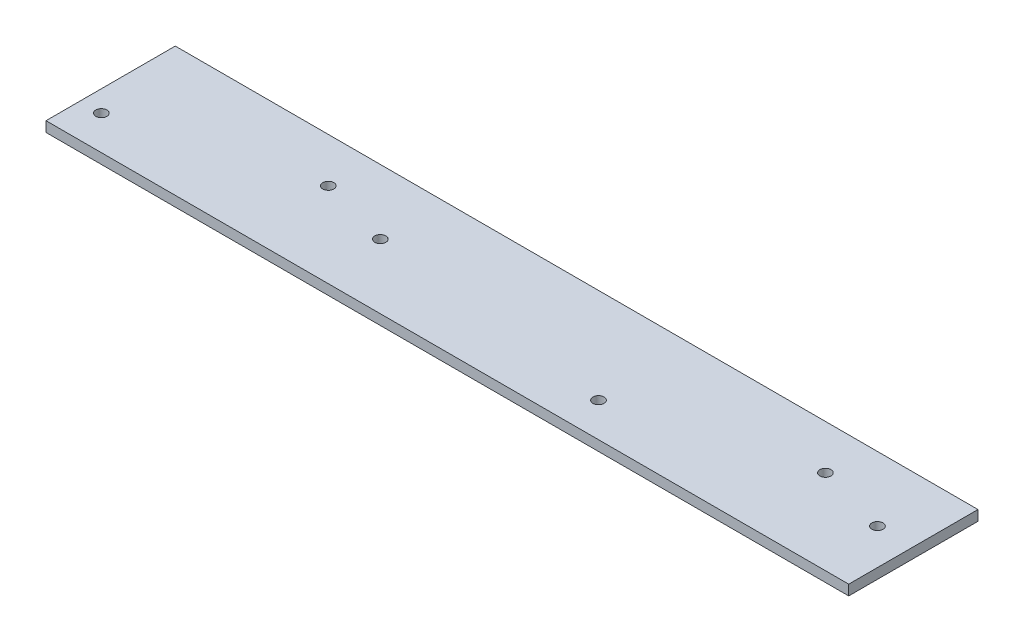
ISO-10303-21;
HEADER;
FILE_DESCRIPTION(('STEP AP214'),'2;1');
FILE_NAME('part.step','',(''),(''),'','','');
FILE_SCHEMA(('AUTOMOTIVE_DESIGN { 1 0 10303 214 1 1 1 1 }'));
ENDSEC;
DATA;
#1=APPLICATION_CONTEXT('core data for automotive mechanical design processes');
#2=APPLICATION_PROTOCOL_DEFINITION('international standard','automotive_design',2000,#1);
#3=PRODUCT_CONTEXT('',#1,'mechanical');
#4=PRODUCT('Part','Part','',(#3));
#5=PRODUCT_RELATED_PRODUCT_CATEGORY('part','',(#4));
#6=PRODUCT_DEFINITION_FORMATION('','',#4);
#7=PRODUCT_DEFINITION_CONTEXT('part definition',#1,'design');
#8=PRODUCT_DEFINITION('design','',#6,#7);
#9=PRODUCT_DEFINITION_SHAPE('','',#8);
#10=(LENGTH_UNIT() NAMED_UNIT(*) SI_UNIT(.MILLI.,.METRE.));
#11=(NAMED_UNIT(*) PLANE_ANGLE_UNIT() SI_UNIT($,.RADIAN.));
#12=(NAMED_UNIT(*) SI_UNIT($,.STERADIAN.) SOLID_ANGLE_UNIT());
#13=UNCERTAINTY_MEASURE_WITH_UNIT(LENGTH_MEASURE(1.E-05),#10,'distance_accuracy_value','');
#14=(GEOMETRIC_REPRESENTATION_CONTEXT(3) GLOBAL_UNCERTAINTY_ASSIGNED_CONTEXT((#13)) GLOBAL_UNIT_ASSIGNED_CONTEXT((#10,
#11,#12)) REPRESENTATION_CONTEXT('',''));
#15=CARTESIAN_POINT('',(0.,0.,0.));
#16=DIRECTION('',(0.,0.,1.));
#17=DIRECTION('',(1.,0.,0.));
#18=AXIS2_PLACEMENT_3D('',#15,#16,#17);
#19=CARTESIAN_POINT('',(0.,1.4605,0.));
#20=DIRECTION('',(0.,-1.,0.));
#21=DIRECTION('',(0.,0.,-1.));
#22=AXIS2_PLACEMENT_3D('',#19,#20,#21);
#23=PLANE('',#22);
#24=CARTESIAN_POINT('',(142.,1.4605,0.));
#25=DIRECTION('',(0.,1.,0.));
#26=DIRECTION('',(0.,0.,1.));
#27=AXIS2_PLACEMENT_3D('',#24,#25,#26);
#28=CIRCLE('',#27,1.58749999999999);
#29=CARTESIAN_POINT('',(142.,1.4605,1.58749999999997));
#30=VERTEX_POINT('',#29);
#31=EDGE_CURVE('E133',#30,#30,#28,.T.);
#32=ORIENTED_EDGE('',*,*,#31,.F.);
#33=EDGE_LOOP('',(#32));
#34=FACE_BOUND('',#33,.T.);
#35=CARTESIAN_POINT('',(0.,1.4605,0.));
#36=DIRECTION('',(0.,1.,0.));
#37=DIRECTION('',(0.,0.,1.));
#38=AXIS2_PLACEMENT_3D('',#35,#36,#37);
#39=CIRCLE('',#38,1.5875);
#40=CARTESIAN_POINT('',(0.,1.4605,1.5875));
#41=VERTEX_POINT('',#40);
#42=EDGE_CURVE('E121',#41,#41,#39,.T.);
#43=ORIENTED_EDGE('',*,*,#42,.F.);
#44=EDGE_LOOP('',(#43));
#45=FACE_BOUND('',#44,.T.);
#46=CARTESIAN_POINT('',(-71.,1.4605,8.69499999999999));
#47=DIRECTION('',(0.,1.,0.));
#48=DIRECTION('',(0.,0.,1.));
#49=AXIS2_PLACEMENT_3D('',#46,#47,#48);
#50=CIRCLE('',#49,1.58750000000007);
#51=CARTESIAN_POINT('',(-71.,1.4605,10.2825000000001));
#52=VERTEX_POINT('',#51);
#53=EDGE_CURVE('E100',#52,#52,#50,.T.);
#54=ORIENTED_EDGE('',*,*,#53,.F.);
#55=EDGE_LOOP('',(#54));
#56=FACE_BOUND('',#55,.T.);
#57=DIRECTION('',(0.,0.,-1.));
#58=VECTOR('',#57,1.);
#59=CARTESIAN_POINT('',(152.256101536452,1.4605,18.4655866878851));
#60=LINE('',#59,#58);
#61=CARTESIAN_POINT('',(152.256101536452,1.4605,18.4655866878851));
#62=VERTEX_POINT('',#61);
#63=CARTESIAN_POINT('',(152.256101536452,1.4605,-18.4655866878852));
#64=VERTEX_POINT('',#63);
#65=EDGE_CURVE('E85',#62,#64,#60,.T.);
#66=ORIENTED_EDGE('',*,*,#65,.T.);
#67=DIRECTION('',(-1.,0.,0.));
#68=VECTOR('',#67,1.);
#69=CARTESIAN_POINT('',(-77.0456646499298,1.4605,-18.4655866878852));
#70=LINE('',#69,#68);
#71=CARTESIAN_POINT('',(-77.0456646499298,1.4605,-18.4655866878852));
#72=VERTEX_POINT('',#71);
#73=EDGE_CURVE('E80',#64,#72,#70,.T.);
#74=ORIENTED_EDGE('',*,*,#73,.T.);
#75=DIRECTION('',(0.,0.,1.));
#76=VECTOR('',#75,1.);
#77=CARTESIAN_POINT('',(-77.0456646499298,1.4605,18.4655866878851));
#78=LINE('',#77,#76);
#79=CARTESIAN_POINT('',(-77.0456646499298,1.4605,18.4655866878851));
#80=VERTEX_POINT('',#79);
#81=EDGE_CURVE('E83',#72,#80,#78,.T.);
#82=ORIENTED_EDGE('',*,*,#81,.T.);
#83=DIRECTION('',(1.,0.,0.));
#84=VECTOR('',#83,1.);
#85=CARTESIAN_POINT('',(-77.0456646499298,1.4605,18.4655866878851));
#86=LINE('',#85,#84);
#87=EDGE_CURVE('E50',#80,#62,#86,.T.);
#88=ORIENTED_EDGE('',*,*,#87,.T.);
#89=EDGE_LOOP('',(#66,#74,#82,#88));
#90=FACE_BOUND('',#89,.T.);
#91=CARTESIAN_POINT('',(71.,1.4605,8.69499999999999));
#92=DIRECTION('',(0.,1.,0.));
#93=DIRECTION('',(0.,0.,1.));
#94=AXIS2_PLACEMENT_3D('',#91,#92,#93);
#95=CIRCLE('',#94,1.5875);
#96=CARTESIAN_POINT('',(71.,1.4605,10.2825));
#97=VERTEX_POINT('',#96);
#98=EDGE_CURVE('E115',#97,#97,#95,.T.);
#99=ORIENTED_EDGE('',*,*,#98,.F.);
#100=EDGE_LOOP('',(#99));
#101=FACE_BOUND('',#100,.T.);
#102=CARTESIAN_POINT('',(-20.62,1.4605,-5.75));
#103=DIRECTION('',(0.,1.,0.));
#104=DIRECTION('',(0.,0.,1.));
#105=AXIS2_PLACEMENT_3D('',#102,#103,#104);
#106=CIRCLE('',#105,1.5875);
#107=CARTESIAN_POINT('',(-20.62,1.4605,-4.1625));
#108=VERTEX_POINT('',#107);
#109=EDGE_CURVE('E127',#108,#108,#106,.T.);
#110=ORIENTED_EDGE('',*,*,#109,.F.);
#111=EDGE_LOOP('',(#110));
#112=FACE_BOUND('',#111,.T.);
#113=CARTESIAN_POINT('',(121.38,1.4605,-5.74999993000001));
#114=DIRECTION('',(0.,1.,0.));
#115=DIRECTION('',(0.,0.,1.));
#116=AXIS2_PLACEMENT_3D('',#113,#114,#115);
#117=CIRCLE('',#116,1.5875);
#118=CARTESIAN_POINT('',(121.38,1.4605,-4.16249993000001));
#119=VERTEX_POINT('',#118);
#120=EDGE_CURVE('E139',#119,#119,#117,.T.);
#121=ORIENTED_EDGE('',*,*,#120,.F.);
#122=EDGE_LOOP('',(#121));
#123=FACE_BOUND('',#122,.T.);
#124=ADVANCED_FACE('F33',(#34,#45,#56,#90,#101,#112,#123),#23,.F.);
#125=CARTESIAN_POINT('',(0.,-1.4605,0.));
#126=DIRECTION('',(0.,-1.,0.));
#127=DIRECTION('',(0.,0.,-1.));
#128=AXIS2_PLACEMENT_3D('',#125,#126,#127);
#129=PLANE('',#128);
#130=CARTESIAN_POINT('',(142.,-1.4605,0.));
#131=DIRECTION('',(0.,1.,0.));
#132=DIRECTION('',(0.,0.,1.));
#133=AXIS2_PLACEMENT_3D('',#130,#131,#132);
#134=CIRCLE('',#133,1.58749999999999);
#135=CARTESIAN_POINT('',(142.,-1.4605,1.58749999999997));
#136=VERTEX_POINT('',#135);
#137=EDGE_CURVE('E136',#136,#136,#134,.T.);
#138=ORIENTED_EDGE('',*,*,#137,.T.);
#139=EDGE_LOOP('',(#138));
#140=FACE_BOUND('',#139,.T.);
#141=CARTESIAN_POINT('',(0.,-1.4605,0.));
#142=DIRECTION('',(0.,1.,0.));
#143=DIRECTION('',(0.,0.,1.));
#144=AXIS2_PLACEMENT_3D('',#141,#142,#143);
#145=CIRCLE('',#144,1.5875);
#146=CARTESIAN_POINT('',(0.,-1.4605,1.5875));
#147=VERTEX_POINT('',#146);
#148=EDGE_CURVE('E124',#147,#147,#145,.T.);
#149=ORIENTED_EDGE('',*,*,#148,.T.);
#150=EDGE_LOOP('',(#149));
#151=FACE_BOUND('',#150,.T.);
#152=CARTESIAN_POINT('',(-71.,-1.4605,8.69499999999999));
#153=DIRECTION('',(0.,1.,0.));
#154=DIRECTION('',(0.,0.,1.));
#155=AXIS2_PLACEMENT_3D('',#152,#153,#154);
#156=CIRCLE('',#155,1.58750000000007);
#157=CARTESIAN_POINT('',(-71.,-1.4605,10.2825000000001));
#158=VERTEX_POINT('',#157);
#159=EDGE_CURVE('E112',#158,#158,#156,.T.);
#160=ORIENTED_EDGE('',*,*,#159,.T.);
#161=EDGE_LOOP('',(#160));
#162=FACE_BOUND('',#161,.T.);
#163=DIRECTION('',(0.,0.,-1.));
#164=VECTOR('',#163,1.);
#165=CARTESIAN_POINT('',(152.256101536452,-1.4605,18.4655866878851));
#166=LINE('',#165,#164);
#167=CARTESIAN_POINT('',(152.256101536452,-1.4605,18.4655866878851));
#168=VERTEX_POINT('',#167);
#169=CARTESIAN_POINT('',(152.256101536452,-1.4605,-18.4655866878852));
#170=VERTEX_POINT('',#169);
#171=EDGE_CURVE('E97',#168,#170,#166,.T.);
#172=ORIENTED_EDGE('',*,*,#171,.F.);
#173=DIRECTION('',(1.,0.,0.));
#174=VECTOR('',#173,1.);
#175=CARTESIAN_POINT('',(-77.0456646499298,-1.4605,18.4655866878851));
#176=LINE('',#175,#174);
#177=CARTESIAN_POINT('',(-77.0456646499298,-1.4605,18.4655866878851));
#178=VERTEX_POINT('',#177);
#179=EDGE_CURVE('E73',#178,#168,#176,.T.);
#180=ORIENTED_EDGE('',*,*,#179,.F.);
#181=DIRECTION('',(0.,0.,1.));
#182=VECTOR('',#181,1.);
#183=CARTESIAN_POINT('',(-77.0456646499298,-1.4605,18.4655866878851));
#184=LINE('',#183,#182);
#185=CARTESIAN_POINT('',(-77.0456646499298,-1.4605,-18.4655866878852));
#186=VERTEX_POINT('',#185);
#187=EDGE_CURVE('E67',#186,#178,#184,.T.);
#188=ORIENTED_EDGE('',*,*,#187,.F.);
#189=DIRECTION('',(-1.,0.,0.));
#190=VECTOR('',#189,1.);
#191=CARTESIAN_POINT('',(-77.0456646499298,-1.4605,-18.4655866878852));
#192=LINE('',#191,#190);
#193=EDGE_CURVE('E89',#170,#186,#192,.T.);
#194=ORIENTED_EDGE('',*,*,#193,.F.);
#195=EDGE_LOOP('',(#172,#180,#188,#194));
#196=FACE_BOUND('',#195,.T.);
#197=CARTESIAN_POINT('',(71.,-1.4605,8.69499999999999));
#198=DIRECTION('',(0.,1.,0.));
#199=DIRECTION('',(0.,0.,1.));
#200=AXIS2_PLACEMENT_3D('',#197,#198,#199);
#201=CIRCLE('',#200,1.5875);
#202=CARTESIAN_POINT('',(71.,-1.4605,10.2825));
#203=VERTEX_POINT('',#202);
#204=EDGE_CURVE('E118',#203,#203,#201,.T.);
#205=ORIENTED_EDGE('',*,*,#204,.T.);
#206=EDGE_LOOP('',(#205));
#207=FACE_BOUND('',#206,.T.);
#208=CARTESIAN_POINT('',(-20.62,-1.4605,-5.75));
#209=DIRECTION('',(0.,1.,0.));
#210=DIRECTION('',(0.,0.,1.));
#211=AXIS2_PLACEMENT_3D('',#208,#209,#210);
#212=CIRCLE('',#211,1.5875);
#213=CARTESIAN_POINT('',(-20.62,-1.4605,-4.1625));
#214=VERTEX_POINT('',#213);
#215=EDGE_CURVE('E130',#214,#214,#212,.T.);
#216=ORIENTED_EDGE('',*,*,#215,.T.);
#217=EDGE_LOOP('',(#216));
#218=FACE_BOUND('',#217,.T.);
#219=CARTESIAN_POINT('',(121.38,-1.4605,-5.74999993000001));
#220=DIRECTION('',(0.,1.,0.));
#221=DIRECTION('',(0.,0.,1.));
#222=AXIS2_PLACEMENT_3D('',#219,#220,#221);
#223=CIRCLE('',#222,1.5875);
#224=CARTESIAN_POINT('',(121.38,-1.4605,-4.16249993000001));
#225=VERTEX_POINT('',#224);
#226=EDGE_CURVE('E142',#225,#225,#223,.T.);
#227=ORIENTED_EDGE('',*,*,#226,.T.);
#228=EDGE_LOOP('',(#227));
#229=FACE_BOUND('',#228,.T.);
#230=ADVANCED_FACE('F108',(#140,#151,#162,#196,#207,#218,#229),#129,.T.);
#231=CARTESIAN_POINT('',(152.256101536452,1.4605,18.4655866878851));
#232=DIRECTION('',(-1.,0.,0.));
#233=DIRECTION('',(0.,0.,1.));
#234=AXIS2_PLACEMENT_3D('',#231,#232,#233);
#235=PLANE('',#234);
#236=ORIENTED_EDGE('',*,*,#171,.T.);
#237=DIRECTION('',(0.,-1.,0.));
#238=VECTOR('',#237,1.);
#239=CARTESIAN_POINT('',(152.256101536452,1.4605,-18.4655866878852));
#240=LINE('',#239,#238);
#241=EDGE_CURVE('E11',#64,#170,#240,.T.);
#242=ORIENTED_EDGE('',*,*,#241,.F.);
#243=ORIENTED_EDGE('',*,*,#65,.F.);
#244=DIRECTION('',(0.,-1.,0.));
#245=VECTOR('',#244,1.);
#246=CARTESIAN_POINT('',(152.256101536452,1.4605,18.4655866878851));
#247=LINE('',#246,#245);
#248=EDGE_CURVE('E93',#62,#168,#247,.T.);
#249=ORIENTED_EDGE('',*,*,#248,.T.);
#250=EDGE_LOOP('',(#236,#242,#243,#249));
#251=FACE_BOUND('',#250,.T.);
#252=ADVANCED_FACE('F35',(#251),#235,.F.);
#253=CARTESIAN_POINT('',(-77.0456646499298,1.4605,-18.4655866878852));
#254=DIRECTION('',(0.,0.,1.));
#255=DIRECTION('',(1.,0.,0.));
#256=AXIS2_PLACEMENT_3D('',#253,#254,#255);
#257=PLANE('',#256);
#258=ORIENTED_EDGE('',*,*,#193,.T.);
#259=DIRECTION('',(0.,-1.,0.));
#260=VECTOR('',#259,1.);
#261=CARTESIAN_POINT('',(-77.0456646499298,1.4605,-18.4655866878852));
#262=LINE('',#261,#260);
#263=EDGE_CURVE('E42',#72,#186,#262,.T.);
#264=ORIENTED_EDGE('',*,*,#263,.F.);
#265=ORIENTED_EDGE('',*,*,#73,.F.);
#266=ORIENTED_EDGE('',*,*,#241,.T.);
#267=EDGE_LOOP('',(#258,#264,#265,#266));
#268=FACE_BOUND('',#267,.T.);
#269=ADVANCED_FACE('F88',(#268),#257,.F.);
#270=CARTESIAN_POINT('',(-77.0456646499298,1.4605,18.4655866878851));
#271=DIRECTION('',(1.,0.,0.));
#272=DIRECTION('',(0.,0.,-1.));
#273=AXIS2_PLACEMENT_3D('',#270,#271,#272);
#274=PLANE('',#273);
#275=ORIENTED_EDGE('',*,*,#187,.T.);
#276=DIRECTION('',(0.,-1.,0.));
#277=VECTOR('',#276,1.);
#278=CARTESIAN_POINT('',(-77.0456646499298,1.4605,18.4655866878851));
#279=LINE('',#278,#277);
#280=EDGE_CURVE('E90',#80,#178,#279,.T.);
#281=ORIENTED_EDGE('',*,*,#280,.F.);
#282=ORIENTED_EDGE('',*,*,#81,.F.);
#283=ORIENTED_EDGE('',*,*,#263,.T.);
#284=EDGE_LOOP('',(#275,#281,#282,#283));
#285=FACE_BOUND('',#284,.T.);
#286=ADVANCED_FACE('F91',(#285),#274,.F.);
#287=CARTESIAN_POINT('',(-77.0456646499298,1.4605,18.4655866878851));
#288=DIRECTION('',(0.,0.,-1.));
#289=DIRECTION('',(-1.,0.,0.));
#290=AXIS2_PLACEMENT_3D('',#287,#288,#289);
#291=PLANE('',#290);
#292=ORIENTED_EDGE('',*,*,#179,.T.);
#293=ORIENTED_EDGE('',*,*,#248,.F.);
#294=ORIENTED_EDGE('',*,*,#87,.F.);
#295=ORIENTED_EDGE('',*,*,#280,.T.);
#296=EDGE_LOOP('',(#292,#293,#294,#295));
#297=FACE_BOUND('',#296,.T.);
#298=ADVANCED_FACE('F105',(#297),#291,.F.);
#299=CARTESIAN_POINT('',(-71.,1.4605,8.69499999999999));
#300=DIRECTION('',(0.,-1.,0.));
#301=DIRECTION('',(0.,0.,-1.));
#302=AXIS2_PLACEMENT_3D('',#299,#300,#301);
#303=CYLINDRICAL_SURFACE('',#302,1.58750000000007);
#304=ORIENTED_EDGE('',*,*,#53,.T.);
#305=EDGE_LOOP('',(#304));
#306=FACE_BOUND('',#305,.T.);
#307=ORIENTED_EDGE('',*,*,#159,.F.);
#308=EDGE_LOOP('',(#307));
#309=FACE_BOUND('',#308,.T.);
#310=ADVANCED_FACE('F162',(#306,#309),#303,.F.);
#311=CARTESIAN_POINT('',(71.,1.4605,8.69499999999999));
#312=DIRECTION('',(0.,-1.,0.));
#313=DIRECTION('',(0.,0.,-1.));
#314=AXIS2_PLACEMENT_3D('',#311,#312,#313);
#315=CYLINDRICAL_SURFACE('',#314,1.5875);
#316=ORIENTED_EDGE('',*,*,#98,.T.);
#317=EDGE_LOOP('',(#316));
#318=FACE_BOUND('',#317,.T.);
#319=ORIENTED_EDGE('',*,*,#204,.F.);
#320=EDGE_LOOP('',(#319));
#321=FACE_BOUND('',#320,.T.);
#322=ADVANCED_FACE('F208',(#318,#321),#315,.F.);
#323=CARTESIAN_POINT('',(0.,1.4605,0.));
#324=DIRECTION('',(0.,-1.,0.));
#325=DIRECTION('',(0.,0.,-1.));
#326=AXIS2_PLACEMENT_3D('',#323,#324,#325);
#327=CYLINDRICAL_SURFACE('',#326,1.5875);
#328=ORIENTED_EDGE('',*,*,#42,.T.);
#329=EDGE_LOOP('',(#328));
#330=FACE_BOUND('',#329,.T.);
#331=ORIENTED_EDGE('',*,*,#148,.F.);
#332=EDGE_LOOP('',(#331));
#333=FACE_BOUND('',#332,.T.);
#334=ADVANCED_FACE('F216',(#330,#333),#327,.F.);
#335=CARTESIAN_POINT('',(-20.62,1.4605,-5.75));
#336=DIRECTION('',(0.,-1.,0.));
#337=DIRECTION('',(0.,0.,-1.));
#338=AXIS2_PLACEMENT_3D('',#335,#336,#337);
#339=CYLINDRICAL_SURFACE('',#338,1.5875);
#340=ORIENTED_EDGE('',*,*,#109,.T.);
#341=EDGE_LOOP('',(#340));
#342=FACE_BOUND('',#341,.T.);
#343=ORIENTED_EDGE('',*,*,#215,.F.);
#344=EDGE_LOOP('',(#343));
#345=FACE_BOUND('',#344,.T.);
#346=ADVANCED_FACE('F224',(#342,#345),#339,.F.);
#347=CARTESIAN_POINT('',(142.,1.4605,0.));
#348=DIRECTION('',(0.,-1.,0.));
#349=DIRECTION('',(0.,0.,-1.));
#350=AXIS2_PLACEMENT_3D('',#347,#348,#349);
#351=CYLINDRICAL_SURFACE('',#350,1.58749999999999);
#352=ORIENTED_EDGE('',*,*,#31,.T.);
#353=EDGE_LOOP('',(#352));
#354=FACE_BOUND('',#353,.T.);
#355=ORIENTED_EDGE('',*,*,#137,.F.);
#356=EDGE_LOOP('',(#355));
#357=FACE_BOUND('',#356,.T.);
#358=ADVANCED_FACE('F233',(#354,#357),#351,.F.);
#359=CARTESIAN_POINT('',(121.38,1.4605,-5.74999993000001));
#360=DIRECTION('',(0.,-1.,0.));
#361=DIRECTION('',(0.,0.,-1.));
#362=AXIS2_PLACEMENT_3D('',#359,#360,#361);
#363=CYLINDRICAL_SURFACE('',#362,1.5875);
#364=ORIENTED_EDGE('',*,*,#120,.T.);
#365=EDGE_LOOP('',(#364));
#366=FACE_BOUND('',#365,.T.);
#367=ORIENTED_EDGE('',*,*,#226,.F.);
#368=EDGE_LOOP('',(#367));
#369=FACE_BOUND('',#368,.T.);
#370=ADVANCED_FACE('F148',(#366,#369),#363,.F.);
#371=CLOSED_SHELL('',(#124,#230,#252,#269,#286,#298,#310,#322,#334,#346,#358,#370));
#372=MANIFOLD_SOLID_BREP('B2',#371);
#373=ADVANCED_BREP_SHAPE_REPRESENTATION('',(#18,#372),#14);
#374=SHAPE_DEFINITION_REPRESENTATION(#9,#373);
ENDSEC;
END-ISO-10303-21;
